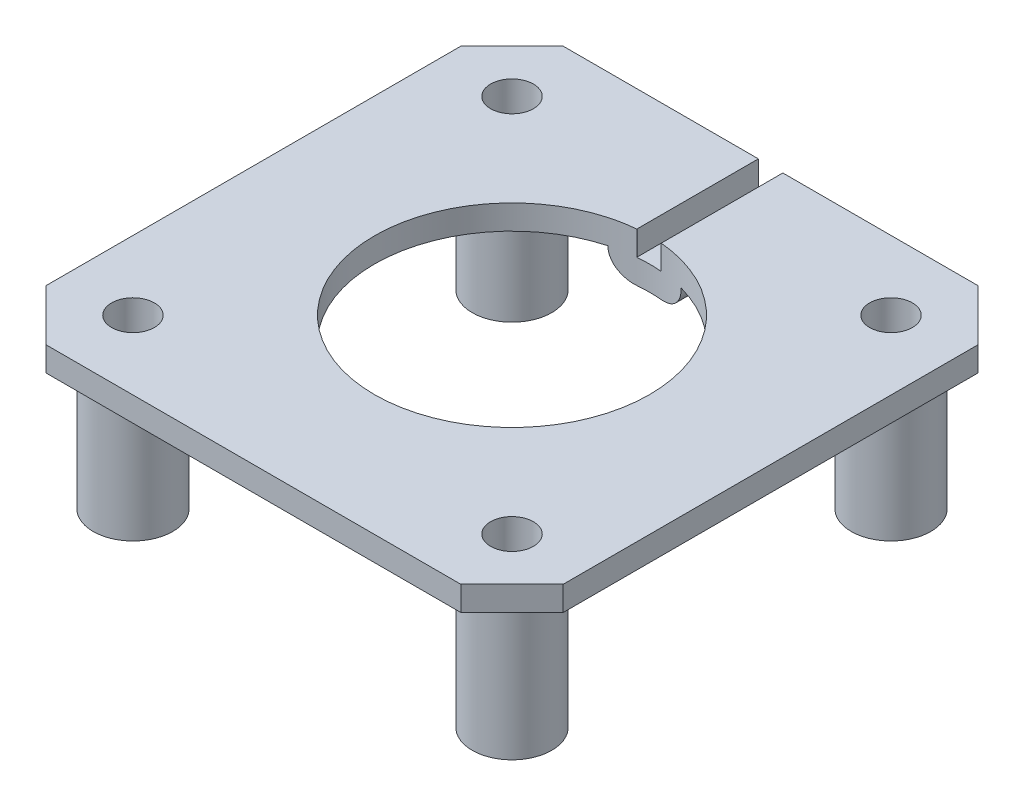
ISO-10303-21;
HEADER;
FILE_DESCRIPTION(('STEP AP214'),'2;1');
FILE_NAME('part.step','',(''),(''),'','','');
FILE_SCHEMA(('AUTOMOTIVE_DESIGN { 1 0 10303 214 1 1 1 1 }'));
ENDSEC;
DATA;
#1=APPLICATION_CONTEXT('core data for automotive mechanical design processes');
#2=APPLICATION_PROTOCOL_DEFINITION('international standard','automotive_design',2000,#1);
#3=PRODUCT_CONTEXT('',#1,'mechanical');
#4=PRODUCT('Part','Part','',(#3));
#5=PRODUCT_RELATED_PRODUCT_CATEGORY('part','',(#4));
#6=PRODUCT_DEFINITION_FORMATION('','',#4);
#7=PRODUCT_DEFINITION_CONTEXT('part definition',#1,'design');
#8=PRODUCT_DEFINITION('design','',#6,#7);
#9=PRODUCT_DEFINITION_SHAPE('','',#8);
#10=(LENGTH_UNIT() NAMED_UNIT(*) SI_UNIT(.MILLI.,.METRE.));
#11=(NAMED_UNIT(*) PLANE_ANGLE_UNIT() SI_UNIT($,.RADIAN.));
#12=(NAMED_UNIT(*) SI_UNIT($,.STERADIAN.) SOLID_ANGLE_UNIT());
#13=UNCERTAINTY_MEASURE_WITH_UNIT(LENGTH_MEASURE(1.E-05),#10,'distance_accuracy_value','');
#14=(GEOMETRIC_REPRESENTATION_CONTEXT(3) GLOBAL_UNCERTAINTY_ASSIGNED_CONTEXT((#13)) GLOBAL_UNIT_ASSIGNED_CONTEXT((#10,
#11,#12)) REPRESENTATION_CONTEXT('',''));
#15=CARTESIAN_POINT('',(0.,0.,0.));
#16=DIRECTION('',(0.,0.,1.));
#17=DIRECTION('',(1.,0.,0.));
#18=AXIS2_PLACEMENT_3D('',#15,#16,#17);
#19=CARTESIAN_POINT('',(0.,11.7,0.));
#20=DIRECTION('',(0.,1.,0.));
#21=DIRECTION('',(0.,0.,1.));
#22=AXIS2_PLACEMENT_3D('',#19,#20,#21);
#23=PLANE('',#22);
#24=CARTESIAN_POINT('',(-15.5,11.7,-15.5));
#25=DIRECTION('',(0.,1.,0.));
#26=DIRECTION('',(0.,0.,1.));
#27=AXIS2_PLACEMENT_3D('',#24,#25,#26);
#28=CIRCLE('',#27,3.25);
#29=CARTESIAN_POINT('',(-15.5,11.7,-12.25));
#30=VERTEX_POINT('',#29);
#31=EDGE_CURVE('E350',#30,#30,#28,.T.);
#32=ORIENTED_EDGE('',*,*,#31,.T.);
#33=EDGE_LOOP('',(#32));
#34=FACE_BOUND('',#33,.T.);
#35=CARTESIAN_POINT('',(15.5,11.7,-15.5));
#36=DIRECTION('',(0.,1.,0.));
#37=DIRECTION('',(0.,0.,1.));
#38=AXIS2_PLACEMENT_3D('',#35,#36,#37);
#39=CIRCLE('',#38,3.25);
#40=CARTESIAN_POINT('',(15.5,11.7,-12.25));
#41=VERTEX_POINT('',#40);
#42=EDGE_CURVE('E342',#41,#41,#39,.F.);
#43=ORIENTED_EDGE('',*,*,#42,.F.);
#44=EDGE_LOOP('',(#43));
#45=FACE_BOUND('',#44,.T.);
#46=CARTESIAN_POINT('',(-15.5,11.7,15.5));
#47=DIRECTION('',(0.,1.,0.));
#48=DIRECTION('',(0.,0.,1.));
#49=AXIS2_PLACEMENT_3D('',#46,#47,#48);
#50=CIRCLE('',#49,3.25);
#51=CARTESIAN_POINT('',(-15.5,11.7,18.75));
#52=VERTEX_POINT('',#51);
#53=EDGE_CURVE('E334',#52,#52,#50,.F.);
#54=ORIENTED_EDGE('',*,*,#53,.F.);
#55=EDGE_LOOP('',(#54));
#56=FACE_BOUND('',#55,.T.);
#57=CARTESIAN_POINT('',(15.5,11.7,15.5));
#58=DIRECTION('',(0.,1.,0.));
#59=DIRECTION('',(0.,0.,1.));
#60=AXIS2_PLACEMENT_3D('',#57,#58,#59);
#61=CIRCLE('',#60,3.25);
#62=CARTESIAN_POINT('',(15.5,11.7,18.75));
#63=VERTEX_POINT('',#62);
#64=EDGE_CURVE('E330',#63,#63,#61,.F.);
#65=ORIENTED_EDGE('',*,*,#64,.F.);
#66=EDGE_LOOP('',(#65));
#67=FACE_BOUND('',#66,.T.);
#68=DIRECTION('',(0.,0.,1.));
#69=VECTOR('',#68,1.);
#70=CARTESIAN_POINT('',(3.,11.7,-21.15));
#71=LINE('',#70,#69);
#72=CARTESIAN_POINT('',(3.,11.7,-21.15));
#73=VERTEX_POINT('',#72);
#74=CARTESIAN_POINT('',(3.,11.7,-10.8426242211007));
#75=VERTEX_POINT('',#74);
#76=EDGE_CURVE('E221',#73,#75,#71,.T.);
#77=ORIENTED_EDGE('',*,*,#76,.F.);
#78=DIRECTION('',(-1.,0.,0.));
#79=VECTOR('',#78,1.);
#80=CARTESIAN_POINT('',(-21.15,11.7,-21.15));
#81=LINE('',#80,#79);
#82=CARTESIAN_POINT('',(16.9630555059549,11.7,-21.15));
#83=VERTEX_POINT('',#82);
#84=EDGE_CURVE('E365',#83,#73,#81,.T.);
#85=ORIENTED_EDGE('',*,*,#84,.F.);
#86=DIRECTION('',(-0.707106781186546,0.,-0.707106781186549));
#87=VECTOR('',#86,1.);
#88=CARTESIAN_POINT('',(19.0565277529775,11.7,-19.0565277529774));
#89=LINE('',#88,#87);
#90=CARTESIAN_POINT('',(21.15,11.7,-16.9630555059549));
#91=VERTEX_POINT('',#90);
#92=EDGE_CURVE('E278',#91,#83,#89,.T.);
#93=ORIENTED_EDGE('',*,*,#92,.F.);
#94=DIRECTION('',(0.,0.,-1.));
#95=VECTOR('',#94,1.);
#96=CARTESIAN_POINT('',(21.15,11.7,-21.15));
#97=LINE('',#96,#95);
#98=CARTESIAN_POINT('',(21.15,11.7,16.9630555059549));
#99=VERTEX_POINT('',#98);
#100=EDGE_CURVE('E359',#99,#91,#97,.T.);
#101=ORIENTED_EDGE('',*,*,#100,.F.);
#102=DIRECTION('',(-0.707106781186546,0.,0.707106781186549));
#103=VECTOR('',#102,1.);
#104=CARTESIAN_POINT('',(19.0565277529775,11.7,19.0565277529774));
#105=LINE('',#104,#103);
#106=CARTESIAN_POINT('',(16.9630555059549,11.7,21.15));
#107=VERTEX_POINT('',#106);
#108=EDGE_CURVE('E306',#99,#107,#105,.T.);
#109=ORIENTED_EDGE('',*,*,#108,.T.);
#110=DIRECTION('',(1.,0.,0.));
#111=VECTOR('',#110,1.);
#112=CARTESIAN_POINT('',(-21.15,11.7,21.15));
#113=LINE('',#112,#111);
#114=CARTESIAN_POINT('',(-16.9630555059549,11.7,21.15));
#115=VERTEX_POINT('',#114);
#116=EDGE_CURVE('E373',#115,#107,#113,.T.);
#117=ORIENTED_EDGE('',*,*,#116,.F.);
#118=DIRECTION('',(0.707106781186546,0.,0.707106781186549));
#119=VECTOR('',#118,1.);
#120=CARTESIAN_POINT('',(-19.0565277529775,11.7,19.0565277529774));
#121=LINE('',#120,#119);
#122=CARTESIAN_POINT('',(-21.15,11.7,16.9630555059549));
#123=VERTEX_POINT('',#122);
#124=EDGE_CURVE('E292',#123,#115,#121,.T.);
#125=ORIENTED_EDGE('',*,*,#124,.F.);
#126=DIRECTION('',(0.,0.,1.));
#127=VECTOR('',#126,1.);
#128=CARTESIAN_POINT('',(-21.15,11.7,-21.15));
#129=LINE('',#128,#127);
#130=CARTESIAN_POINT('',(-21.15,11.7,-16.9630555059549));
#131=VERTEX_POINT('',#130);
#132=EDGE_CURVE('E369',#131,#123,#129,.T.);
#133=ORIENTED_EDGE('',*,*,#132,.F.);
#134=DIRECTION('',(0.707106781186546,0.,-0.707106781186549));
#135=VECTOR('',#134,1.);
#136=CARTESIAN_POINT('',(-19.0565277529775,11.7,-19.0565277529774));
#137=LINE('',#136,#135);
#138=CARTESIAN_POINT('',(-16.9630555059549,11.7,-21.15));
#139=VERTEX_POINT('',#138);
#140=EDGE_CURVE('E321',#131,#139,#137,.T.);
#141=ORIENTED_EDGE('',*,*,#140,.T.);
#142=CARTESIAN_POINT('',(-3.,11.7,-21.15));
#143=VERTEX_POINT('',#142);
#144=EDGE_CURVE('E363',#143,#139,#81,.T.);
#145=ORIENTED_EDGE('',*,*,#144,.F.);
#146=DIRECTION('',(0.,0.,-1.));
#147=VECTOR('',#146,1.);
#148=CARTESIAN_POINT('',(-3.,11.7,-21.15));
#149=LINE('',#148,#147);
#150=CARTESIAN_POINT('',(-3.,11.7,-10.8426242211007));
#151=VERTEX_POINT('',#150);
#152=EDGE_CURVE('E227',#151,#143,#149,.T.);
#153=ORIENTED_EDGE('',*,*,#152,.F.);
#154=CARTESIAN_POINT('',(0.,11.7,0.));
#155=DIRECTION('',(0.,1.,0.));
#156=DIRECTION('',(0.,0.,1.));
#157=AXIS2_PLACEMENT_3D('',#154,#155,#156);
#158=CIRCLE('',#157,11.25);
#159=EDGE_CURVE('E351',#151,#75,#158,.T.);
#160=ORIENTED_EDGE('',*,*,#159,.T.);
#161=EDGE_LOOP('',(#77,#85,#93,#101,#109,#117,#125,#133,#141,#145,#153,#160));
#162=FACE_BOUND('',#161,.T.);
#163=ADVANCED_FACE('F39',(#34,#45,#56,#67,#162),#23,.F.);
#164=CARTESIAN_POINT('',(21.15,11.7,-21.15));
#165=DIRECTION('',(1.,0.,0.));
#166=DIRECTION('',(0.,0.,-1.));
#167=AXIS2_PLACEMENT_3D('',#164,#165,#166);
#168=PLANE('',#167);
#169=ORIENTED_EDGE('',*,*,#100,.T.);
#170=DIRECTION('',(0.,1.,0.));
#171=VECTOR('',#170,1.);
#172=CARTESIAN_POINT('',(21.15,0.,-16.9630555059549));
#173=LINE('',#172,#171);
#174=CARTESIAN_POINT('',(21.15,13.7,-16.9630555059549));
#175=VERTEX_POINT('',#174);
#176=EDGE_CURVE('E273',#91,#175,#173,.T.);
#177=ORIENTED_EDGE('',*,*,#176,.T.);
#178=DIRECTION('',(0.,0.,-1.));
#179=VECTOR('',#178,1.);
#180=CARTESIAN_POINT('',(21.15,13.7,-21.15));
#181=LINE('',#180,#179);
#182=CARTESIAN_POINT('',(21.15,13.7,16.9630555059549));
#183=VERTEX_POINT('',#182);
#184=EDGE_CURVE('E355',#183,#175,#181,.T.);
#185=ORIENTED_EDGE('',*,*,#184,.F.);
#186=DIRECTION('',(0.,1.,0.));
#187=VECTOR('',#186,1.);
#188=CARTESIAN_POINT('',(21.15,0.,16.9630555059549));
#189=LINE('',#188,#187);
#190=EDGE_CURVE('E312',#99,#183,#189,.T.);
#191=ORIENTED_EDGE('',*,*,#190,.F.);
#192=EDGE_LOOP('',(#169,#177,#185,#191));
#193=FACE_BOUND('',#192,.T.);
#194=ADVANCED_FACE('F435',(#193),#168,.T.);
#195=CARTESIAN_POINT('',(-21.15,11.7,21.15));
#196=DIRECTION('',(0.,0.,1.));
#197=DIRECTION('',(1.,0.,0.));
#198=AXIS2_PLACEMENT_3D('',#195,#196,#197);
#199=PLANE('',#198);
#200=DIRECTION('',(1.,0.,0.));
#201=VECTOR('',#200,1.);
#202=CARTESIAN_POINT('',(-21.15,13.7,21.15));
#203=LINE('',#202,#201);
#204=CARTESIAN_POINT('',(-16.9630555059549,13.7,21.15));
#205=VERTEX_POINT('',#204);
#206=CARTESIAN_POINT('',(16.9630555059549,13.7,21.15));
#207=VERTEX_POINT('',#206);
#208=EDGE_CURVE('E364',#205,#207,#203,.T.);
#209=ORIENTED_EDGE('',*,*,#208,.F.);
#210=DIRECTION('',(0.,1.,0.));
#211=VECTOR('',#210,1.);
#212=CARTESIAN_POINT('',(-16.9630555059549,0.,21.15));
#213=LINE('',#212,#211);
#214=EDGE_CURVE('E272',#115,#205,#213,.T.);
#215=ORIENTED_EDGE('',*,*,#214,.F.);
#216=ORIENTED_EDGE('',*,*,#116,.T.);
#217=DIRECTION('',(0.,1.,0.));
#218=VECTOR('',#217,1.);
#219=CARTESIAN_POINT('',(16.9630555059549,0.,21.15));
#220=LINE('',#219,#218);
#221=EDGE_CURVE('E301',#107,#207,#220,.T.);
#222=ORIENTED_EDGE('',*,*,#221,.T.);
#223=EDGE_LOOP('',(#209,#215,#216,#222));
#224=FACE_BOUND('',#223,.T.);
#225=ADVANCED_FACE('F437',(#224),#199,.T.);
#226=CARTESIAN_POINT('',(-21.15,11.7,-21.15));
#227=DIRECTION('',(-1.,0.,0.));
#228=DIRECTION('',(0.,0.,1.));
#229=AXIS2_PLACEMENT_3D('',#226,#227,#228);
#230=PLANE('',#229);
#231=ORIENTED_EDGE('',*,*,#132,.T.);
#232=DIRECTION('',(0.,1.,0.));
#233=VECTOR('',#232,1.);
#234=CARTESIAN_POINT('',(-21.15,0.,16.9630555059549));
#235=LINE('',#234,#233);
#236=CARTESIAN_POINT('',(-21.15,13.7,16.9630555059549));
#237=VERTEX_POINT('',#236);
#238=EDGE_CURVE('E274',#123,#237,#235,.T.);
#239=ORIENTED_EDGE('',*,*,#238,.T.);
#240=DIRECTION('',(0.,0.,1.));
#241=VECTOR('',#240,1.);
#242=CARTESIAN_POINT('',(-21.15,13.7,-21.15));
#243=LINE('',#242,#241);
#244=CARTESIAN_POINT('',(-21.15,13.7,-16.9630555059549));
#245=VERTEX_POINT('',#244);
#246=EDGE_CURVE('E385',#245,#237,#243,.T.);
#247=ORIENTED_EDGE('',*,*,#246,.F.);
#248=DIRECTION('',(0.,1.,0.));
#249=VECTOR('',#248,1.);
#250=CARTESIAN_POINT('',(-21.15,0.,-16.9630555059549));
#251=LINE('',#250,#249);
#252=EDGE_CURVE('E300',#131,#245,#251,.T.);
#253=ORIENTED_EDGE('',*,*,#252,.F.);
#254=EDGE_LOOP('',(#231,#239,#247,#253));
#255=FACE_BOUND('',#254,.T.);
#256=ADVANCED_FACE('F440',(#255),#230,.T.);
#257=CARTESIAN_POINT('',(-21.15,11.7,-21.15));
#258=DIRECTION('',(0.,0.,-1.));
#259=DIRECTION('',(-1.,0.,0.));
#260=AXIS2_PLACEMENT_3D('',#257,#258,#259);
#261=PLANE('',#260);
#262=ORIENTED_EDGE('',*,*,#84,.T.);
#263=CARTESIAN_POINT('',(1.,11.7,-21.15));
#264=DIRECTION('',(0.,0.,-1.));
#265=DIRECTION('',(-1.,0.,0.));
#266=AXIS2_PLACEMENT_3D('',#263,#264,#265);
#267=CIRCLE('',#266,2.);
#268=CARTESIAN_POINT('',(1.,9.7,-21.15));
#269=VERTEX_POINT('',#268);
#270=EDGE_CURVE('E11',#73,#269,#267,.T.);
#271=ORIENTED_EDGE('',*,*,#270,.T.);
#272=DIRECTION('',(1.,0.,0.));
#273=VECTOR('',#272,1.);
#274=CARTESIAN_POINT('',(3.,9.7,-21.15));
#275=LINE('',#274,#273);
#276=CARTESIAN_POINT('',(-1.,9.7,-21.15));
#277=VERTEX_POINT('',#276);
#278=EDGE_CURVE('E222',#277,#269,#275,.T.);
#279=ORIENTED_EDGE('',*,*,#278,.F.);
#280=CARTESIAN_POINT('',(-1.,11.7,-21.15));
#281=DIRECTION('',(0.,0.,-1.));
#282=DIRECTION('',(-1.,0.,0.));
#283=AXIS2_PLACEMENT_3D('',#280,#281,#282);
#284=CIRCLE('',#283,2.);
#285=EDGE_CURVE('E49',#277,#143,#284,.T.);
#286=ORIENTED_EDGE('',*,*,#285,.T.);
#287=ORIENTED_EDGE('',*,*,#144,.T.);
#288=DIRECTION('',(0.,1.,0.));
#289=VECTOR('',#288,1.);
#290=CARTESIAN_POINT('',(-16.9630555059549,0.,-21.15));
#291=LINE('',#290,#289);
#292=CARTESIAN_POINT('',(-16.9630555059549,13.7,-21.15));
#293=VERTEX_POINT('',#292);
#294=EDGE_CURVE('E302',#139,#293,#291,.T.);
#295=ORIENTED_EDGE('',*,*,#294,.T.);
#296=DIRECTION('',(-1.,0.,0.));
#297=VECTOR('',#296,1.);
#298=CARTESIAN_POINT('',(-21.15,13.7,-21.15));
#299=LINE('',#298,#297);
#300=CARTESIAN_POINT('',(-1.,13.7,-21.15));
#301=VERTEX_POINT('',#300);
#302=EDGE_CURVE('E380',#301,#293,#299,.T.);
#303=ORIENTED_EDGE('',*,*,#302,.F.);
#304=DIRECTION('',(0.,1.,0.));
#305=VECTOR('',#304,1.);
#306=CARTESIAN_POINT('',(-1.,11.7,-21.15));
#307=LINE('',#306,#305);
#308=CARTESIAN_POINT('',(-1.,11.7,-21.15));
#309=VERTEX_POINT('',#308);
#310=EDGE_CURVE('E214',#309,#301,#307,.T.);
#311=ORIENTED_EDGE('',*,*,#310,.F.);
#312=DIRECTION('',(1.,0.,0.));
#313=VECTOR('',#312,1.);
#314=CARTESIAN_POINT('',(-21.15,11.7,-21.15));
#315=LINE('',#314,#313);
#316=CARTESIAN_POINT('',(1.00000000000002,11.7,-21.15));
#317=VERTEX_POINT('',#316);
#318=EDGE_CURVE('E213',#309,#317,#315,.T.);
#319=ORIENTED_EDGE('',*,*,#318,.T.);
#320=DIRECTION('',(0.,1.,0.));
#321=VECTOR('',#320,1.);
#322=CARTESIAN_POINT('',(1.00000000000002,11.7,-21.15));
#323=LINE('',#322,#321);
#324=CARTESIAN_POINT('',(1.00000000000002,13.7,-21.15));
#325=VERTEX_POINT('',#324);
#326=EDGE_CURVE('E190',#317,#325,#323,.T.);
#327=ORIENTED_EDGE('',*,*,#326,.T.);
#328=CARTESIAN_POINT('',(16.9630555059549,13.7,-21.15));
#329=VERTEX_POINT('',#328);
#330=EDGE_CURVE('E381',#329,#325,#299,.T.);
#331=ORIENTED_EDGE('',*,*,#330,.F.);
#332=DIRECTION('',(0.,1.,0.));
#333=VECTOR('',#332,1.);
#334=CARTESIAN_POINT('',(16.9630555059549,0.,-21.15));
#335=LINE('',#334,#333);
#336=EDGE_CURVE('E284',#83,#329,#335,.T.);
#337=ORIENTED_EDGE('',*,*,#336,.F.);
#338=EDGE_LOOP('',(#262,#271,#279,#286,#287,#295,#303,#311,#319,#327,#331,#337));
#339=FACE_BOUND('',#338,.T.);
#340=ADVANCED_FACE('F444',(#339),#261,.T.);
#341=CARTESIAN_POINT('',(-15.5,13.7,-15.5));
#342=DIRECTION('',(0.,1.,0.));
#343=DIRECTION('',(0.,0.,1.));
#344=AXIS2_PLACEMENT_3D('',#341,#342,#343);
#345=PLANE('',#344);
#346=CARTESIAN_POINT('',(0.,13.7,-11.25));
#347=DIRECTION('',(0.,1.,0.));
#348=DIRECTION('',(0.,0.,1.));
#349=AXIS2_PLACEMENT_3D('',#346,#347,#348);
#350=CIRCLE('',#349,1.);
#351=CARTESIAN_POINT('',(-1.,13.7,-11.25));
#352=VERTEX_POINT('',#351);
#353=CARTESIAN_POINT('',(-0.999011857466179,13.7,-11.2055555555556));
#354=VERTEX_POINT('',#353);
#355=EDGE_CURVE('E201',#352,#354,#350,.T.);
#356=ORIENTED_EDGE('',*,*,#355,.F.);
#357=DIRECTION('',(0.,0.,1.));
#358=VECTOR('',#357,1.);
#359=CARTESIAN_POINT('',(-1.,13.7,-11.25));
#360=LINE('',#359,#358);
#361=EDGE_CURVE('E180',#301,#352,#360,.T.);
#362=ORIENTED_EDGE('',*,*,#361,.F.);
#363=ORIENTED_EDGE('',*,*,#302,.T.);
#364=DIRECTION('',(0.707106781186546,0.,-0.707106781186549));
#365=VECTOR('',#364,1.);
#366=CARTESIAN_POINT('',(-16.9630555059549,13.7,-21.15));
#367=LINE('',#366,#365);
#368=EDGE_CURVE('E296',#245,#293,#367,.T.);
#369=ORIENTED_EDGE('',*,*,#368,.F.);
#370=ORIENTED_EDGE('',*,*,#246,.T.);
#371=DIRECTION('',(0.707106781186546,0.,0.707106781186549));
#372=VECTOR('',#371,1.);
#373=CARTESIAN_POINT('',(-16.9630555059549,13.7,21.15));
#374=LINE('',#373,#372);
#375=EDGE_CURVE('E268',#237,#205,#374,.T.);
#376=ORIENTED_EDGE('',*,*,#375,.T.);
#377=ORIENTED_EDGE('',*,*,#208,.T.);
#378=DIRECTION('',(-0.707106781186546,0.,0.707106781186549));
#379=VECTOR('',#378,1.);
#380=CARTESIAN_POINT('',(16.9630555059549,13.7,21.15));
#381=LINE('',#380,#379);
#382=EDGE_CURVE('E295',#183,#207,#381,.T.);
#383=ORIENTED_EDGE('',*,*,#382,.F.);
#384=ORIENTED_EDGE('',*,*,#184,.T.);
#385=DIRECTION('',(-0.707106781186546,0.,-0.707106781186549));
#386=VECTOR('',#385,1.);
#387=CARTESIAN_POINT('',(16.9630555059549,13.7,-21.15));
#388=LINE('',#387,#386);
#389=EDGE_CURVE('E264',#175,#329,#388,.T.);
#390=ORIENTED_EDGE('',*,*,#389,.T.);
#391=ORIENTED_EDGE('',*,*,#330,.T.);
#392=DIRECTION('',(0.,0.,-1.));
#393=VECTOR('',#392,1.);
#394=CARTESIAN_POINT('',(1.,13.7,-11.25));
#395=LINE('',#394,#393);
#396=CARTESIAN_POINT('',(1.,13.7,-11.25));
#397=VERTEX_POINT('',#396);
#398=EDGE_CURVE('E204',#397,#325,#395,.T.);
#399=ORIENTED_EDGE('',*,*,#398,.F.);
#400=CARTESIAN_POINT('',(0.999011857466179,13.7,-11.2055555555556));
#401=VERTEX_POINT('',#400);
#402=EDGE_CURVE('E186',#401,#397,#350,.T.);
#403=ORIENTED_EDGE('',*,*,#402,.F.);
#404=CARTESIAN_POINT('',(0.,13.7,0.));
#405=DIRECTION('',(0.,1.,0.));
#406=DIRECTION('',(0.,0.,1.));
#407=AXIS2_PLACEMENT_3D('',#404,#405,#406);
#408=CIRCLE('',#407,11.25);
#409=EDGE_CURVE('E346',#354,#401,#408,.T.);
#410=ORIENTED_EDGE('',*,*,#409,.F.);
#411=EDGE_LOOP('',(#356,#362,#363,#369,#370,#376,#377,#383,#384,#390,#391,#399,#403,#410));
#412=FACE_BOUND('',#411,.T.);
#413=CARTESIAN_POINT('',(15.5,13.7,15.5));
#414=DIRECTION('',(0.,1.,0.));
#415=DIRECTION('',(0.,0.,1.));
#416=AXIS2_PLACEMENT_3D('',#413,#414,#415);
#417=CIRCLE('',#416,1.75);
#418=CARTESIAN_POINT('',(15.5,13.7,17.25));
#419=VERTEX_POINT('',#418);
#420=EDGE_CURVE('E236',#419,#419,#417,.T.);
#421=ORIENTED_EDGE('',*,*,#420,.F.);
#422=EDGE_LOOP('',(#421));
#423=FACE_BOUND('',#422,.T.);
#424=CARTESIAN_POINT('',(-15.5,13.7,15.5));
#425=DIRECTION('',(0.,-1.,0.));
#426=DIRECTION('',(0.,0.,1.));
#427=AXIS2_PLACEMENT_3D('',#424,#425,#426);
#428=CIRCLE('',#427,1.75);
#429=CARTESIAN_POINT('',(-15.5,13.7,17.25));
#430=VERTEX_POINT('',#429);
#431=EDGE_CURVE('E244',#430,#430,#428,.T.);
#432=ORIENTED_EDGE('',*,*,#431,.T.);
#433=EDGE_LOOP('',(#432));
#434=FACE_BOUND('',#433,.T.);
#435=CARTESIAN_POINT('',(-15.5,13.7,-15.5));
#436=DIRECTION('',(0.,1.,0.));
#437=DIRECTION('',(0.,0.,-1.));
#438=AXIS2_PLACEMENT_3D('',#435,#436,#437);
#439=CIRCLE('',#438,1.75);
#440=CARTESIAN_POINT('',(-15.5,13.7,-17.25));
#441=VERTEX_POINT('',#440);
#442=EDGE_CURVE('E252',#441,#441,#439,.T.);
#443=ORIENTED_EDGE('',*,*,#442,.F.);
#444=EDGE_LOOP('',(#443));
#445=FACE_BOUND('',#444,.T.);
#446=CARTESIAN_POINT('',(15.5,13.7,-15.5));
#447=DIRECTION('',(0.,-1.,0.));
#448=DIRECTION('',(0.,0.,-1.));
#449=AXIS2_PLACEMENT_3D('',#446,#447,#448);
#450=CIRCLE('',#449,1.75);
#451=CARTESIAN_POINT('',(15.5,13.7,-17.25));
#452=VERTEX_POINT('',#451);
#453=EDGE_CURVE('E260',#452,#452,#450,.T.);
#454=ORIENTED_EDGE('',*,*,#453,.T.);
#455=EDGE_LOOP('',(#454));
#456=FACE_BOUND('',#455,.T.);
#457=ADVANCED_FACE('F448',(#412,#423,#434,#445,#456),#345,.T.);
#458=CARTESIAN_POINT('',(-15.5,13.7,-15.5));
#459=DIRECTION('',(0.,-1.,0.));
#460=DIRECTION('',(0.,0.,-1.));
#461=AXIS2_PLACEMENT_3D('',#458,#459,#460);
#462=CYLINDRICAL_SURFACE('',#461,3.25);
#463=CARTESIAN_POINT('',(-15.5,0.,-15.5));
#464=DIRECTION('',(0.,1.,0.));
#465=DIRECTION('',(0.,0.,1.));
#466=AXIS2_PLACEMENT_3D('',#463,#464,#465);
#467=CIRCLE('',#466,3.25);
#468=CARTESIAN_POINT('',(-15.5,0.,-12.25));
#469=VERTEX_POINT('',#468);
#470=EDGE_CURVE('E376',#469,#469,#467,.T.);
#471=ORIENTED_EDGE('',*,*,#470,.T.);
#472=EDGE_LOOP('',(#471));
#473=FACE_BOUND('',#472,.T.);
#474=ORIENTED_EDGE('',*,*,#31,.F.);
#475=EDGE_LOOP('',(#474));
#476=FACE_BOUND('',#475,.T.);
#477=ADVANCED_FACE('F455',(#473,#476),#462,.T.);
#478=CARTESIAN_POINT('',(-15.5,0.,-15.5));
#479=DIRECTION('',(0.,1.,0.));
#480=DIRECTION('',(0.,0.,1.));
#481=AXIS2_PLACEMENT_3D('',#478,#479,#480);
#482=PLANE('',#481);
#483=CARTESIAN_POINT('',(-15.5,0.,-15.5));
#484=DIRECTION('',(0.,1.,0.));
#485=DIRECTION('',(0.,0.,-1.));
#486=AXIS2_PLACEMENT_3D('',#483,#484,#485);
#487=CIRCLE('',#486,1.75);
#488=CARTESIAN_POINT('',(-15.5,0.,-17.25));
#489=VERTEX_POINT('',#488);
#490=EDGE_CURVE('E248',#489,#489,#487,.T.);
#491=ORIENTED_EDGE('',*,*,#490,.T.);
#492=EDGE_LOOP('',(#491));
#493=FACE_BOUND('',#492,.T.);
#494=ORIENTED_EDGE('',*,*,#470,.F.);
#495=EDGE_LOOP('',(#494));
#496=FACE_BOUND('',#495,.T.);
#497=ADVANCED_FACE('F430',(#493,#496),#482,.F.);
#498=CARTESIAN_POINT('',(0.,11.7,0.));
#499=DIRECTION('',(0.,1.,0.));
#500=DIRECTION('',(0.,0.,1.));
#501=AXIS2_PLACEMENT_3D('',#498,#499,#500);
#502=CYLINDRICAL_SURFACE('',#501,11.25);
#503=CARTESIAN_POINT('',(0.,9.7,0.));
#504=DIRECTION('',(0.,1.,0.));
#505=DIRECTION('',(0.,0.,-1.));
#506=AXIS2_PLACEMENT_3D('',#503,#504,#505);
#507=CIRCLE('',#506,11.25);
#508=CARTESIAN_POINT('',(1.,9.7,-11.2054674155075));
#509=VERTEX_POINT('',#508);
#510=CARTESIAN_POINT('',(-1.,9.7,-11.2054674155075));
#511=VERTEX_POINT('',#510);
#512=EDGE_CURVE('E226',#509,#511,#507,.T.);
#513=ORIENTED_EDGE('',*,*,#512,.F.);
#514=CARTESIAN_POINT('',(1.,9.7,-11.2054674155075));
#515=CARTESIAN_POINT('',(1.05652137712966,9.69999995922506,-11.2004257536843));
#516=CARTESIAN_POINT('',(1.11297515675127,9.7023973819327,-11.1949536908237));
#517=CARTESIAN_POINT('',(1.22538675989289,9.71193940944393,-11.1832067239525));
#518=CARTESIAN_POINT('',(1.28134466321158,9.71908323584159,-11.1769319517217));
#519=CARTESIAN_POINT('',(1.44769378111679,9.74751816410484,-11.1570198182803));
#520=CARTESIAN_POINT('',(1.55683613429646,9.77581322564727,-11.1422697881196));
#521=CARTESIAN_POINT('',(1.76849510152452,9.85013098345242,-11.1106440023832));
#522=CARTESIAN_POINT('',(1.87101213744284,9.89615254967092,-11.0937683823576));
#523=CARTESIAN_POINT('',(2.06681345417187,10.0045858173669,-11.0589634956746));
#524=CARTESIAN_POINT('',(2.16009607049488,10.0670004662885,-11.0410340399899));
#525=CARTESIAN_POINT('',(2.33619988215312,10.2075381115826,-11.0051294520018));
#526=CARTESIAN_POINT('',(2.41885411895511,10.2858711525222,-10.9871572721465));
#527=CARTESIAN_POINT('',(2.56985602888053,10.4556308408519,-10.9528238371631));
#528=CARTESIAN_POINT('',(2.63820159379141,10.5470594143754,-10.9364628196085));
#529=CARTESIAN_POINT('',(2.75841811332296,10.740365237789,-10.9067625762617));
#530=CARTESIAN_POINT('',(2.81032126724105,10.8422215425866,-10.8934174592911));
#531=CARTESIAN_POINT('',(2.89610466791204,11.0536485305109,-10.8709273048526));
#532=CARTESIAN_POINT('',(2.93000238664585,11.1632116178144,-10.8617781968746));
#533=CARTESIAN_POINT('',(2.96947729341388,11.3446623201154,-10.8510344482646));
#534=CARTESIAN_POINT('',(2.98090994043087,11.4152379204789,-10.8478929678433));
#535=CARTESIAN_POINT('',(2.99617285653093,11.5571963933771,-10.843683307826));
#536=CARTESIAN_POINT('',(3.00001058368593,11.6285784046682,-10.8426130943068));
#537=CARTESIAN_POINT('',(3.,11.7,-10.8426242211007));
#538=B_SPLINE_CURVE_WITH_KNOTS('',3,(#514,#515,#516,#517,#518,#519,#520,#521,#522,#523,#524,
#525,#526,#527,#528,#529,#530,#531,#532,#533,#534,#535,#536,#537),.UNSPECIFIED.,.F.,.F.,(4,2,2,
2,2,2,2,2,2,2,2,4),(0.,0.170128491910598,0.340229089787075,0.679610505052962,1.01897028872521,
1.35839113044094,1.70262130865556,2.04690216945286,2.39050459390637,2.7337729840338,
2.94806155601857,3.16213959593741),.UNSPECIFIED.);
#539=EDGE_CURVE('E64',#509,#75,#538,.T.);
#540=ORIENTED_EDGE('',*,*,#539,.T.);
#541=ORIENTED_EDGE('',*,*,#159,.F.);
#542=CARTESIAN_POINT('',(-3.,11.7,-10.8426242211007));
#543=CARTESIAN_POINT('',(-3.00000077265228,11.6449282104595,-10.8426214970644));
#544=CARTESIAN_POINT('',(-2.99772384986868,11.5898836792596,-10.8432542659089));
#545=CARTESIAN_POINT('',(-2.98864784338186,11.4802061471915,-10.8457603257705));
#546=CARTESIAN_POINT('',(-2.98184950466578,11.4255730800264,-10.8476334124221));
#547=CARTESIAN_POINT('',(-2.95477478323023,11.2631214799681,-10.8550530663965));
#548=CARTESIAN_POINT('',(-2.92781823037414,11.1564193033764,-10.8624003934926));
#549=CARTESIAN_POINT('',(-2.85698623559565,10.949264216177,-10.8812432131608));
#550=CARTESIAN_POINT('',(-2.81311199105812,10.8488108638799,-10.8927384121549));
#551=CARTESIAN_POINT('',(-2.70979073308613,10.6566822359318,-10.9188994331417));
#552=CARTESIAN_POINT('',(-2.65033947654842,10.5650093613462,-10.9335661188417));
#553=CARTESIAN_POINT('',(-2.51616162541191,10.3909619977965,-10.9652299172544));
#554=CARTESIAN_POINT('',(-2.44114338062998,10.3088202122552,-10.9822691096306));
#555=CARTESIAN_POINT('',(-2.27863872228586,10.1581292744329,-11.0171321755556));
#556=CARTESIAN_POINT('',(-2.19114889235998,10.0895838589748,-11.0349562631846));
#557=CARTESIAN_POINT('',(-2.00362052827604,9.96631758572695,-11.0705614790249));
#558=CARTESIAN_POINT('',(-1.90332010513211,9.91199123413397,-11.0883300637907));
#559=CARTESIAN_POINT('',(-1.69473277375296,9.82109902899055,-11.1221182782178));
#560=CARTESIAN_POINT('',(-1.58645124143371,9.7845213439736,-11.1381390674422));
#561=CARTESIAN_POINT('',(-1.3980932920637,9.73838880425529,-11.1630628069744));
#562=CARTESIAN_POINT('',(-1.3192538751319,9.72402563868302,-11.1726623996293));
#563=CARTESIAN_POINT('',(-1.16031707883083,9.70482696012574,-11.190291961602));
#564=CARTESIAN_POINT('',(-1.08022075050333,9.69998387394915,-11.1983231739763));
#565=CARTESIAN_POINT('',(-1.,9.7,-11.2054674155075));
#566=B_SPLINE_CURVE_WITH_KNOTS('',3,(#542,#543,#544,#545,#546,#547,#548,#549,#550,#551,#552,
#553,#554,#555,#556,#557,#558,#559,#560,#561,#562,#563,#564,#565),.UNSPECIFIED.,.F.,.F.,(4,2,2,
2,2,2,2,2,2,2,2,4),(0.,0.165111038552442,0.33019487873667,0.659381801419234,0.988545429487206,
1.31779881353074,1.65389151701287,1.99007646452764,2.33478379439488,2.67926102160539,
2.9208352840488,3.16221729707318),.UNSPECIFIED.);
#567=EDGE_CURVE('E56',#151,#511,#566,.T.);
#568=ORIENTED_EDGE('',*,*,#567,.T.);
#569=EDGE_LOOP('',(#513,#540,#541,#568));
#570=FACE_BOUND('',#569,.T.);
#571=CARTESIAN_POINT('',(0.,11.7,0.));
#572=DIRECTION('',(0.,1.,0.));
#573=DIRECTION('',(0.,0.,1.));
#574=AXIS2_PLACEMENT_3D('',#571,#572,#573);
#575=CIRCLE('',#574,11.25);
#576=CARTESIAN_POINT('',(-0.999011857466179,11.7,-11.2055555555556));
#577=VERTEX_POINT('',#576);
#578=CARTESIAN_POINT('',(0.999011857466179,11.7,-11.2055555555556));
#579=VERTEX_POINT('',#578);
#580=EDGE_CURVE('E175',#577,#579,#575,.F.);
#581=ORIENTED_EDGE('',*,*,#580,.F.);
#582=DIRECTION('',(0.,1.,0.));
#583=VECTOR('',#582,1.);
#584=CARTESIAN_POINT('',(-0.999011857466179,12.7,-11.2055555555556));
#585=LINE('',#584,#583);
#586=EDGE_CURVE('E402',#577,#354,#585,.T.);
#587=ORIENTED_EDGE('',*,*,#586,.T.);
#588=ORIENTED_EDGE('',*,*,#409,.T.);
#589=DIRECTION('',(0.,1.,0.));
#590=VECTOR('',#589,1.);
#591=CARTESIAN_POINT('',(0.999011857466179,12.7,-11.2055555555556));
#592=LINE('',#591,#590);
#593=EDGE_CURVE('E399',#401,#579,#592,.F.);
#594=ORIENTED_EDGE('',*,*,#593,.T.);
#595=EDGE_LOOP('',(#581,#587,#588,#594));
#596=FACE_BOUND('',#595,.T.);
#597=ADVANCED_FACE('F424',(#570,#596),#502,.F.);
#598=CARTESIAN_POINT('',(15.5,13.7,-15.5));
#599=DIRECTION('',(0.,-1.,0.));
#600=DIRECTION('',(0.,0.,-1.));
#601=AXIS2_PLACEMENT_3D('',#598,#599,#600);
#602=CYLINDRICAL_SURFACE('',#601,3.25);
#603=CARTESIAN_POINT('',(15.5,0.,-15.5));
#604=DIRECTION('',(0.,-1.,0.));
#605=DIRECTION('',(0.,0.,1.));
#606=AXIS2_PLACEMENT_3D('',#603,#604,#605);
#607=CIRCLE('',#606,3.25);
#608=CARTESIAN_POINT('',(15.5,0.,-12.25));
#609=VERTEX_POINT('',#608);
#610=EDGE_CURVE('E338',#609,#609,#607,.T.);
#611=ORIENTED_EDGE('',*,*,#610,.F.);
#612=EDGE_LOOP('',(#611));
#613=FACE_BOUND('',#612,.T.);
#614=ORIENTED_EDGE('',*,*,#42,.T.);
#615=EDGE_LOOP('',(#614));
#616=FACE_BOUND('',#615,.T.);
#617=ADVANCED_FACE('F429',(#613,#616),#602,.T.);
#618=CARTESIAN_POINT('',(15.5,0.,-15.5));
#619=DIRECTION('',(0.,1.,0.));
#620=DIRECTION('',(0.,0.,1.));
#621=AXIS2_PLACEMENT_3D('',#618,#619,#620);
#622=PLANE('',#621);
#623=CARTESIAN_POINT('',(15.5,0.,-15.5));
#624=DIRECTION('',(0.,-1.,0.));
#625=DIRECTION('',(0.,0.,-1.));
#626=AXIS2_PLACEMENT_3D('',#623,#624,#625);
#627=CIRCLE('',#626,1.75);
#628=CARTESIAN_POINT('',(15.5,0.,-17.25));
#629=VERTEX_POINT('',#628);
#630=EDGE_CURVE('E256',#629,#629,#627,.T.);
#631=ORIENTED_EDGE('',*,*,#630,.F.);
#632=EDGE_LOOP('',(#631));
#633=FACE_BOUND('',#632,.T.);
#634=ORIENTED_EDGE('',*,*,#610,.T.);
#635=EDGE_LOOP('',(#634));
#636=FACE_BOUND('',#635,.T.);
#637=ADVANCED_FACE('F573',(#633,#636),#622,.F.);
#638=CARTESIAN_POINT('',(-15.5,13.7,15.5));
#639=DIRECTION('',(0.,-1.,0.));
#640=DIRECTION('',(0.,0.,1.));
#641=AXIS2_PLACEMENT_3D('',#638,#639,#640);
#642=CYLINDRICAL_SURFACE('',#641,3.25);
#643=CARTESIAN_POINT('',(-15.5,0.,15.5));
#644=DIRECTION('',(0.,-1.,0.));
#645=DIRECTION('',(0.,0.,-1.));
#646=AXIS2_PLACEMENT_3D('',#643,#644,#645);
#647=CIRCLE('',#646,3.25);
#648=CARTESIAN_POINT('',(-15.5,0.,12.25));
#649=VERTEX_POINT('',#648);
#650=EDGE_CURVE('E329',#649,#649,#647,.T.);
#651=ORIENTED_EDGE('',*,*,#650,.F.);
#652=EDGE_LOOP('',(#651));
#653=FACE_BOUND('',#652,.T.);
#654=ORIENTED_EDGE('',*,*,#53,.T.);
#655=EDGE_LOOP('',(#654));
#656=FACE_BOUND('',#655,.T.);
#657=ADVANCED_FACE('F570',(#653,#656),#642,.T.);
#658=CARTESIAN_POINT('',(-15.5,0.,15.5));
#659=DIRECTION('',(0.,1.,0.));
#660=DIRECTION('',(0.,0.,-1.));
#661=AXIS2_PLACEMENT_3D('',#658,#659,#660);
#662=PLANE('',#661);
#663=CARTESIAN_POINT('',(-15.5,0.,15.5));
#664=DIRECTION('',(0.,-1.,0.));
#665=DIRECTION('',(0.,0.,1.));
#666=AXIS2_PLACEMENT_3D('',#663,#664,#665);
#667=CIRCLE('',#666,1.75);
#668=CARTESIAN_POINT('',(-15.5,0.,17.25));
#669=VERTEX_POINT('',#668);
#670=EDGE_CURVE('E240',#669,#669,#667,.T.);
#671=ORIENTED_EDGE('',*,*,#670,.F.);
#672=EDGE_LOOP('',(#671));
#673=FACE_BOUND('',#672,.T.);
#674=ORIENTED_EDGE('',*,*,#650,.T.);
#675=EDGE_LOOP('',(#674));
#676=FACE_BOUND('',#675,.T.);
#677=ADVANCED_FACE('F566',(#673,#676),#662,.F.);
#678=CARTESIAN_POINT('',(15.5,13.7,15.5));
#679=DIRECTION('',(0.,-1.,0.));
#680=DIRECTION('',(0.,0.,1.));
#681=AXIS2_PLACEMENT_3D('',#678,#679,#680);
#682=CYLINDRICAL_SURFACE('',#681,3.25);
#683=CARTESIAN_POINT('',(15.5,0.,15.5));
#684=DIRECTION('',(0.,1.,0.));
#685=DIRECTION('',(0.,0.,-1.));
#686=AXIS2_PLACEMENT_3D('',#683,#684,#685);
#687=CIRCLE('',#686,3.25);
#688=CARTESIAN_POINT('',(15.5,0.,12.25));
#689=VERTEX_POINT('',#688);
#690=EDGE_CURVE('E325',#689,#689,#687,.T.);
#691=ORIENTED_EDGE('',*,*,#690,.T.);
#692=EDGE_LOOP('',(#691));
#693=FACE_BOUND('',#692,.T.);
#694=ORIENTED_EDGE('',*,*,#64,.T.);
#695=EDGE_LOOP('',(#694));
#696=FACE_BOUND('',#695,.T.);
#697=ADVANCED_FACE('F562',(#693,#696),#682,.T.);
#698=CARTESIAN_POINT('',(15.5,0.,15.5));
#699=DIRECTION('',(0.,1.,0.));
#700=DIRECTION('',(0.,0.,-1.));
#701=AXIS2_PLACEMENT_3D('',#698,#699,#700);
#702=PLANE('',#701);
#703=CARTESIAN_POINT('',(15.5,0.,15.5));
#704=DIRECTION('',(0.,1.,0.));
#705=DIRECTION('',(0.,0.,1.));
#706=AXIS2_PLACEMENT_3D('',#703,#704,#705);
#707=CIRCLE('',#706,1.75);
#708=CARTESIAN_POINT('',(15.5,0.,17.25));
#709=VERTEX_POINT('',#708);
#710=EDGE_CURVE('E230',#709,#709,#707,.T.);
#711=ORIENTED_EDGE('',*,*,#710,.T.);
#712=EDGE_LOOP('',(#711));
#713=FACE_BOUND('',#712,.T.);
#714=ORIENTED_EDGE('',*,*,#690,.F.);
#715=EDGE_LOOP('',(#714));
#716=FACE_BOUND('',#715,.T.);
#717=ADVANCED_FACE('F559',(#713,#716),#702,.F.);
#718=CARTESIAN_POINT('',(16.9630555059549,0.,21.15));
#719=DIRECTION('',(-0.707106781186549,0.,-0.707106781186546));
#720=DIRECTION('',(-0.707106781186546,0.,0.707106781186549));
#721=AXIS2_PLACEMENT_3D('',#718,#719,#720);
#722=PLANE('',#721);
#723=ORIENTED_EDGE('',*,*,#190,.T.);
#724=ORIENTED_EDGE('',*,*,#382,.T.);
#725=ORIENTED_EDGE('',*,*,#221,.F.);
#726=ORIENTED_EDGE('',*,*,#108,.F.);
#727=EDGE_LOOP('',(#723,#724,#725,#726));
#728=FACE_BOUND('',#727,.T.);
#729=ADVANCED_FACE('F509',(#728),#722,.F.);
#730=CARTESIAN_POINT('',(-16.9630555059549,0.,-21.15));
#731=DIRECTION('',(0.707106781186549,0.,0.707106781186546));
#732=DIRECTION('',(0.707106781186546,0.,-0.707106781186549));
#733=AXIS2_PLACEMENT_3D('',#730,#731,#732);
#734=PLANE('',#733);
#735=ORIENTED_EDGE('',*,*,#252,.T.);
#736=ORIENTED_EDGE('',*,*,#368,.T.);
#737=ORIENTED_EDGE('',*,*,#294,.F.);
#738=ORIENTED_EDGE('',*,*,#140,.F.);
#739=EDGE_LOOP('',(#735,#736,#737,#738));
#740=FACE_BOUND('',#739,.T.);
#741=ADVANCED_FACE('F497',(#740),#734,.F.);
#742=CARTESIAN_POINT('',(16.9630555059549,0.,-21.15));
#743=DIRECTION('',(0.707106781186549,0.,-0.707106781186546));
#744=DIRECTION('',(-0.707106781186546,0.,-0.707106781186549));
#745=AXIS2_PLACEMENT_3D('',#742,#743,#744);
#746=PLANE('',#745);
#747=ORIENTED_EDGE('',*,*,#92,.T.);
#748=ORIENTED_EDGE('',*,*,#336,.T.);
#749=ORIENTED_EDGE('',*,*,#389,.F.);
#750=ORIENTED_EDGE('',*,*,#176,.F.);
#751=EDGE_LOOP('',(#747,#748,#749,#750));
#752=FACE_BOUND('',#751,.T.);
#753=ADVANCED_FACE('F514',(#752),#746,.T.);
#754=CARTESIAN_POINT('',(-16.9630555059549,0.,21.15));
#755=DIRECTION('',(-0.707106781186549,0.,0.707106781186546));
#756=DIRECTION('',(0.707106781186546,0.,0.707106781186549));
#757=AXIS2_PLACEMENT_3D('',#754,#755,#756);
#758=PLANE('',#757);
#759=ORIENTED_EDGE('',*,*,#124,.T.);
#760=ORIENTED_EDGE('',*,*,#214,.T.);
#761=ORIENTED_EDGE('',*,*,#375,.F.);
#762=ORIENTED_EDGE('',*,*,#238,.F.);
#763=EDGE_LOOP('',(#759,#760,#761,#762));
#764=FACE_BOUND('',#763,.T.);
#765=ADVANCED_FACE('F503',(#764),#758,.T.);
#766=CARTESIAN_POINT('',(15.5,13.7,-15.5));
#767=DIRECTION('',(0.,-1.,0.));
#768=DIRECTION('',(0.,0.,-1.));
#769=AXIS2_PLACEMENT_3D('',#766,#767,#768);
#770=CYLINDRICAL_SURFACE('',#769,1.75);
#771=ORIENTED_EDGE('',*,*,#453,.F.);
#772=EDGE_LOOP('',(#771));
#773=FACE_BOUND('',#772,.T.);
#774=ORIENTED_EDGE('',*,*,#630,.T.);
#775=EDGE_LOOP('',(#774));
#776=FACE_BOUND('',#775,.T.);
#777=ADVANCED_FACE('F546',(#773,#776),#770,.F.);
#778=CARTESIAN_POINT('',(-15.5,13.7,-15.5));
#779=DIRECTION('',(0.,-1.,0.));
#780=DIRECTION('',(0.,0.,-1.));
#781=AXIS2_PLACEMENT_3D('',#778,#779,#780);
#782=CYLINDRICAL_SURFACE('',#781,1.75);
#783=ORIENTED_EDGE('',*,*,#442,.T.);
#784=EDGE_LOOP('',(#783));
#785=FACE_BOUND('',#784,.T.);
#786=ORIENTED_EDGE('',*,*,#490,.F.);
#787=EDGE_LOOP('',(#786));
#788=FACE_BOUND('',#787,.T.);
#789=ADVANCED_FACE('F542',(#785,#788),#782,.F.);
#790=CARTESIAN_POINT('',(-15.5,13.7,15.5));
#791=DIRECTION('',(0.,-1.,0.));
#792=DIRECTION('',(0.,0.,-1.));
#793=AXIS2_PLACEMENT_3D('',#790,#791,#792);
#794=CYLINDRICAL_SURFACE('',#793,1.75);
#795=ORIENTED_EDGE('',*,*,#431,.F.);
#796=EDGE_LOOP('',(#795));
#797=FACE_BOUND('',#796,.T.);
#798=ORIENTED_EDGE('',*,*,#670,.T.);
#799=EDGE_LOOP('',(#798));
#800=FACE_BOUND('',#799,.T.);
#801=ADVANCED_FACE('F538',(#797,#800),#794,.F.);
#802=CARTESIAN_POINT('',(15.5,13.7,15.5));
#803=DIRECTION('',(0.,-1.,0.));
#804=DIRECTION('',(0.,0.,-1.));
#805=AXIS2_PLACEMENT_3D('',#802,#803,#804);
#806=CYLINDRICAL_SURFACE('',#805,1.75);
#807=ORIENTED_EDGE('',*,*,#420,.T.);
#808=EDGE_LOOP('',(#807));
#809=FACE_BOUND('',#808,.T.);
#810=ORIENTED_EDGE('',*,*,#710,.F.);
#811=EDGE_LOOP('',(#810));
#812=FACE_BOUND('',#811,.T.);
#813=ADVANCED_FACE('F535',(#809,#812),#806,.F.);
#814=CARTESIAN_POINT('',(0.,9.7,0.));
#815=DIRECTION('',(0.,-1.,0.));
#816=DIRECTION('',(0.,0.,-1.));
#817=AXIS2_PLACEMENT_3D('',#814,#815,#816);
#818=PLANE('',#817);
#819=ORIENTED_EDGE('',*,*,#278,.T.);
#820=DIRECTION('',(0.,0.,1.));
#821=VECTOR('',#820,1.);
#822=CARTESIAN_POINT('',(1.,9.7,-10.8426242211007));
#823=LINE('',#822,#821);
#824=EDGE_CURVE('E410',#269,#509,#823,.T.);
#825=ORIENTED_EDGE('',*,*,#824,.T.);
#826=ORIENTED_EDGE('',*,*,#512,.T.);
#827=DIRECTION('',(0.,0.,-1.));
#828=VECTOR('',#827,1.);
#829=CARTESIAN_POINT('',(-1.,9.7,-21.15));
#830=LINE('',#829,#828);
#831=EDGE_CURVE('E406',#511,#277,#830,.T.);
#832=ORIENTED_EDGE('',*,*,#831,.T.);
#833=EDGE_LOOP('',(#819,#825,#826,#832));
#834=FACE_BOUND('',#833,.T.);
#835=ADVANCED_FACE('F477',(#834),#818,.T.);
#836=CARTESIAN_POINT('',(0.,11.7,-11.25));
#837=DIRECTION('',(0.,1.,0.));
#838=DIRECTION('',(0.,0.,1.));
#839=AXIS2_PLACEMENT_3D('',#836,#837,#838);
#840=CYLINDRICAL_SURFACE('',#839,1.);
#841=CARTESIAN_POINT('',(0.,11.7,-11.25));
#842=DIRECTION('',(0.,1.,0.));
#843=DIRECTION('',(0.,0.,1.));
#844=AXIS2_PLACEMENT_3D('',#841,#842,#843);
#845=CIRCLE('',#844,1.);
#846=CARTESIAN_POINT('',(-1.,11.7,-11.25));
#847=VERTEX_POINT('',#846);
#848=EDGE_CURVE('E179',#847,#577,#845,.T.);
#849=ORIENTED_EDGE('',*,*,#848,.F.);
#850=DIRECTION('',(0.,1.,0.));
#851=VECTOR('',#850,1.);
#852=CARTESIAN_POINT('',(-1.,11.7,-11.25));
#853=LINE('',#852,#851);
#854=EDGE_CURVE('E210',#847,#352,#853,.T.);
#855=ORIENTED_EDGE('',*,*,#854,.T.);
#856=ORIENTED_EDGE('',*,*,#355,.T.);
#857=ORIENTED_EDGE('',*,*,#586,.F.);
#858=EDGE_LOOP('',(#849,#855,#856,#857));
#859=FACE_BOUND('',#858,.T.);
#860=ADVANCED_FACE('F521',(#859),#840,.F.);
#861=ORIENTED_EDGE('',*,*,#402,.T.);
#862=DIRECTION('',(0.,1.,0.));
#863=VECTOR('',#862,1.);
#864=CARTESIAN_POINT('',(1.,11.7,-11.25));
#865=LINE('',#864,#863);
#866=CARTESIAN_POINT('',(1.,11.7,-11.25));
#867=VERTEX_POINT('',#866);
#868=EDGE_CURVE('E183',#867,#397,#865,.T.);
#869=ORIENTED_EDGE('',*,*,#868,.F.);
#870=EDGE_CURVE('E167',#579,#867,#845,.T.);
#871=ORIENTED_EDGE('',*,*,#870,.F.);
#872=ORIENTED_EDGE('',*,*,#593,.F.);
#873=EDGE_LOOP('',(#861,#869,#871,#872));
#874=FACE_BOUND('',#873,.T.);
#875=ADVANCED_FACE('F184',(#874),#840,.F.);
#876=CARTESIAN_POINT('',(0.,11.7,-11.25));
#877=DIRECTION('',(0.,1.,0.));
#878=DIRECTION('',(0.,0.,1.));
#879=AXIS2_PLACEMENT_3D('',#876,#877,#878);
#880=PLANE('',#879);
#881=DIRECTION('',(0.,0.,1.));
#882=VECTOR('',#881,1.);
#883=CARTESIAN_POINT('',(-1.,11.7,-11.25));
#884=LINE('',#883,#882);
#885=EDGE_CURVE('E191',#309,#847,#884,.T.);
#886=ORIENTED_EDGE('',*,*,#885,.T.);
#887=ORIENTED_EDGE('',*,*,#848,.T.);
#888=ORIENTED_EDGE('',*,*,#580,.T.);
#889=ORIENTED_EDGE('',*,*,#870,.T.);
#890=DIRECTION('',(0.,0.,-1.));
#891=VECTOR('',#890,1.);
#892=CARTESIAN_POINT('',(1.,11.7,-11.25));
#893=LINE('',#892,#891);
#894=EDGE_CURVE('E172',#867,#317,#893,.T.);
#895=ORIENTED_EDGE('',*,*,#894,.T.);
#896=ORIENTED_EDGE('',*,*,#318,.F.);
#897=EDGE_LOOP('',(#886,#887,#888,#889,#895,#896));
#898=FACE_BOUND('',#897,.T.);
#899=ADVANCED_FACE('F170',(#898),#880,.T.);
#900=CARTESIAN_POINT('',(-1.,11.7,-11.25));
#901=DIRECTION('',(-1.,0.,0.));
#902=DIRECTION('',(0.,0.,1.));
#903=AXIS2_PLACEMENT_3D('',#900,#901,#902);
#904=PLANE('',#903);
#905=ORIENTED_EDGE('',*,*,#361,.T.);
#906=ORIENTED_EDGE('',*,*,#854,.F.);
#907=ORIENTED_EDGE('',*,*,#885,.F.);
#908=ORIENTED_EDGE('',*,*,#310,.T.);
#909=EDGE_LOOP('',(#905,#906,#907,#908));
#910=FACE_BOUND('',#909,.T.);
#911=ADVANCED_FACE('F470',(#910),#904,.F.);
#912=CARTESIAN_POINT('',(1.,11.7,-11.25));
#913=DIRECTION('',(1.,0.,0.));
#914=DIRECTION('',(0.,0.,-1.));
#915=AXIS2_PLACEMENT_3D('',#912,#913,#914);
#916=PLANE('',#915);
#917=ORIENTED_EDGE('',*,*,#398,.T.);
#918=ORIENTED_EDGE('',*,*,#326,.F.);
#919=ORIENTED_EDGE('',*,*,#894,.F.);
#920=ORIENTED_EDGE('',*,*,#868,.T.);
#921=EDGE_LOOP('',(#917,#918,#919,#920));
#922=FACE_BOUND('',#921,.T.);
#923=ADVANCED_FACE('F193',(#922),#916,.F.);
#924=CARTESIAN_POINT('',(1.,11.7,0.));
#925=DIRECTION('',(0.,0.,-1.));
#926=DIRECTION('',(-1.,0.,0.));
#927=AXIS2_PLACEMENT_3D('',#924,#925,#926);
#928=CYLINDRICAL_SURFACE('',#927,2.);
#929=ORIENTED_EDGE('',*,*,#270,.F.);
#930=ORIENTED_EDGE('',*,*,#76,.T.);
#931=ORIENTED_EDGE('',*,*,#539,.F.);
#932=ORIENTED_EDGE('',*,*,#824,.F.);
#933=EDGE_LOOP('',(#929,#930,#931,#932));
#934=FACE_BOUND('',#933,.T.);
#935=ADVANCED_FACE('F462',(#934),#928,.T.);
#936=CARTESIAN_POINT('',(-1.,11.7,0.));
#937=DIRECTION('',(0.,0.,1.));
#938=DIRECTION('',(1.,0.,0.));
#939=AXIS2_PLACEMENT_3D('',#936,#937,#938);
#940=CYLINDRICAL_SURFACE('',#939,2.);
#941=ORIENTED_EDGE('',*,*,#567,.F.);
#942=ORIENTED_EDGE('',*,*,#152,.T.);
#943=ORIENTED_EDGE('',*,*,#285,.F.);
#944=ORIENTED_EDGE('',*,*,#831,.F.);
#945=EDGE_LOOP('',(#941,#942,#943,#944));
#946=FACE_BOUND('',#945,.T.);
#947=ADVANCED_FACE('F41',(#946),#940,.T.);
#948=CLOSED_SHELL('',(#163,#194,#225,#256,#340,#457,#477,#497,#597,#617,#637,#657,#677,#697,
#717,#729,#741,#753,#765,#777,#789,#801,#813,#835,#860,#875,#899,#911,#923,#935,#947));
#949=MANIFOLD_SOLID_BREP('B2',#948);
#950=ADVANCED_BREP_SHAPE_REPRESENTATION('',(#18,#949),#14);
#951=SHAPE_DEFINITION_REPRESENTATION(#9,#950);
ENDSEC;
END-ISO-10303-21;
